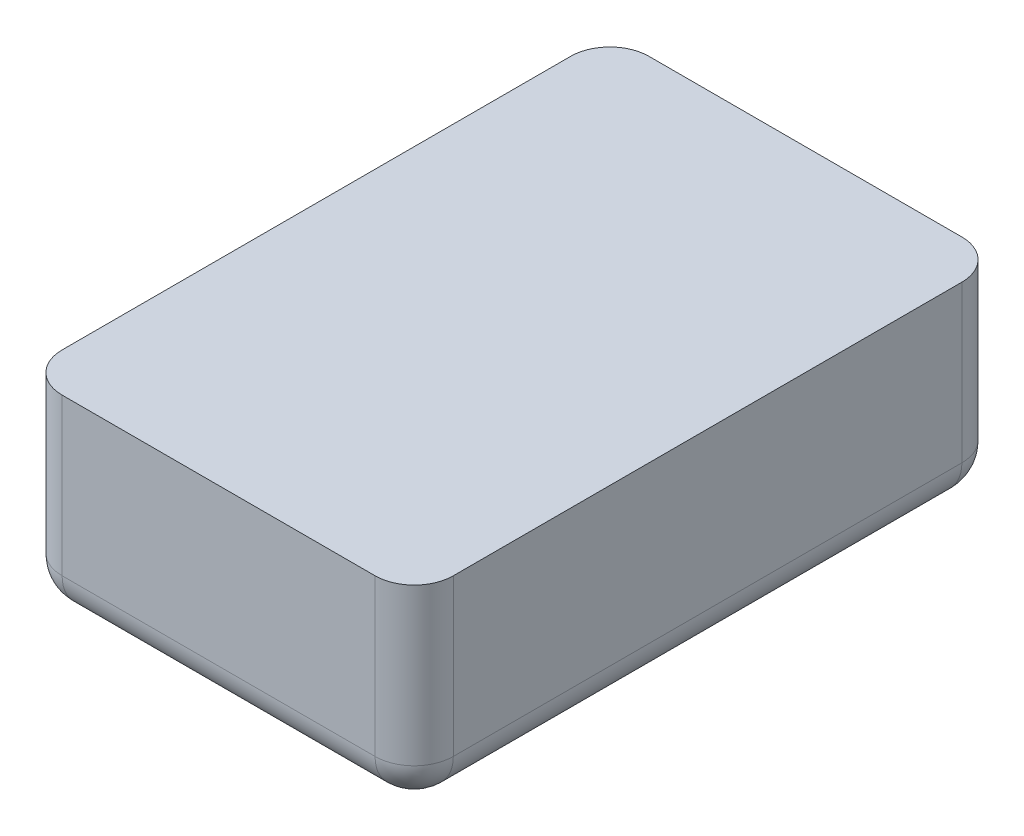
ISO-10303-21;
HEADER;
FILE_DESCRIPTION(('STEP AP214'),'2;1');
FILE_NAME('part.step','',(''),(''),'','','');
FILE_SCHEMA(('AUTOMOTIVE_DESIGN { 1 0 10303 214 1 1 1 1 }'));
ENDSEC;
DATA;
#1=APPLICATION_CONTEXT('core data for automotive mechanical design processes');
#2=APPLICATION_PROTOCOL_DEFINITION('international standard','automotive_design',2000,#1);
#3=PRODUCT_CONTEXT('',#1,'mechanical');
#4=PRODUCT('Part','Part','',(#3));
#5=PRODUCT_RELATED_PRODUCT_CATEGORY('part','',(#4));
#6=PRODUCT_DEFINITION_FORMATION('','',#4);
#7=PRODUCT_DEFINITION_CONTEXT('part definition',#1,'design');
#8=PRODUCT_DEFINITION('design','',#6,#7);
#9=PRODUCT_DEFINITION_SHAPE('','',#8);
#10=(LENGTH_UNIT() NAMED_UNIT(*) SI_UNIT(.MILLI.,.METRE.));
#11=(NAMED_UNIT(*) PLANE_ANGLE_UNIT() SI_UNIT($,.RADIAN.));
#12=(NAMED_UNIT(*) SI_UNIT($,.STERADIAN.) SOLID_ANGLE_UNIT());
#13=UNCERTAINTY_MEASURE_WITH_UNIT(LENGTH_MEASURE(1.E-05),#10,'distance_accuracy_value','');
#14=(GEOMETRIC_REPRESENTATION_CONTEXT(3) GLOBAL_UNCERTAINTY_ASSIGNED_CONTEXT((#13)) GLOBAL_UNIT_ASSIGNED_CONTEXT((#10,
#11,#12)) REPRESENTATION_CONTEXT('',''));
#15=CARTESIAN_POINT('',(0.,0.,0.));
#16=DIRECTION('',(0.,0.,1.));
#17=DIRECTION('',(1.,0.,0.));
#18=AXIS2_PLACEMENT_3D('',#15,#16,#17);
#19=CARTESIAN_POINT('',(0.,50.,0.));
#20=DIRECTION('',(1.,0.,0.));
#21=DIRECTION('',(0.,0.,-1.));
#22=AXIS2_PLACEMENT_3D('',#19,#20,#21);
#23=PLANE('',#22);
#24=DIRECTION('',(0.,0.,1.));
#25=VECTOR('',#24,1.);
#26=CARTESIAN_POINT('',(0.,10.,0.));
#27=LINE('',#26,#25);
#28=CARTESIAN_POINT('',(0.,10.,-140.));
#29=VERTEX_POINT('',#28);
#30=CARTESIAN_POINT('',(0.,10.,-10.));
#31=VERTEX_POINT('',#30);
#32=EDGE_CURVE('E49',#29,#31,#27,.T.);
#33=ORIENTED_EDGE('',*,*,#32,.T.);
#34=DIRECTION('',(0.,-1.,0.));
#35=VECTOR('',#34,1.);
#36=CARTESIAN_POINT('',(0.,50.,-10.));
#37=LINE('',#36,#35);
#38=CARTESIAN_POINT('',(0.,50.,-10.));
#39=VERTEX_POINT('',#38);
#40=EDGE_CURVE('E163',#31,#39,#37,.F.);
#41=ORIENTED_EDGE('',*,*,#40,.T.);
#42=DIRECTION('',(0.,0.,1.));
#43=VECTOR('',#42,1.);
#44=CARTESIAN_POINT('',(0.,50.,0.));
#45=LINE('',#44,#43);
#46=CARTESIAN_POINT('',(0.,50.,-140.));
#47=VERTEX_POINT('',#46);
#48=EDGE_CURVE('E198',#47,#39,#45,.T.);
#49=ORIENTED_EDGE('',*,*,#48,.F.);
#50=DIRECTION('',(0.,-1.,0.));
#51=VECTOR('',#50,1.);
#52=CARTESIAN_POINT('',(0.,50.,-140.));
#53=LINE('',#52,#51);
#54=EDGE_CURVE('E54',#47,#29,#53,.T.);
#55=ORIENTED_EDGE('',*,*,#54,.T.);
#56=EDGE_LOOP('',(#33,#41,#49,#55));
#57=FACE_BOUND('',#56,.T.);
#58=ADVANCED_FACE('F32',(#57),#23,.F.);
#59=CARTESIAN_POINT('',(0.,50.,0.));
#60=DIRECTION('',(0.,0.,-1.));
#61=DIRECTION('',(-1.,0.,0.));
#62=AXIS2_PLACEMENT_3D('',#59,#60,#61);
#63=PLANE('',#62);
#64=DIRECTION('',(1.,0.,0.));
#65=VECTOR('',#64,1.);
#66=CARTESIAN_POINT('',(0.,50.,0.));
#67=LINE('',#66,#65);
#68=CARTESIAN_POINT('',(10.,50.,0.));
#69=VERTEX_POINT('',#68);
#70=CARTESIAN_POINT('',(90.,50.,0.));
#71=VERTEX_POINT('',#70);
#72=EDGE_CURVE('E200',#69,#71,#67,.T.);
#73=ORIENTED_EDGE('',*,*,#72,.F.);
#74=DIRECTION('',(0.,-1.,0.));
#75=VECTOR('',#74,1.);
#76=CARTESIAN_POINT('',(10.,50.,0.));
#77=LINE('',#76,#75);
#78=CARTESIAN_POINT('',(10.,10.,0.));
#79=VERTEX_POINT('',#78);
#80=EDGE_CURVE('E159',#69,#79,#77,.T.);
#81=ORIENTED_EDGE('',*,*,#80,.T.);
#82=DIRECTION('',(1.,0.,0.));
#83=VECTOR('',#82,1.);
#84=CARTESIAN_POINT('',(100.,10.,0.));
#85=LINE('',#84,#83);
#86=CARTESIAN_POINT('',(90.,10.,0.));
#87=VERTEX_POINT('',#86);
#88=EDGE_CURVE('E157',#79,#87,#85,.T.);
#89=ORIENTED_EDGE('',*,*,#88,.T.);
#90=DIRECTION('',(0.,-1.,0.));
#91=VECTOR('',#90,1.);
#92=CARTESIAN_POINT('',(90.,50.,0.));
#93=LINE('',#92,#91);
#94=EDGE_CURVE('E155',#87,#71,#93,.F.);
#95=ORIENTED_EDGE('',*,*,#94,.T.);
#96=EDGE_LOOP('',(#73,#81,#89,#95));
#97=FACE_BOUND('',#96,.T.);
#98=ADVANCED_FACE('F249',(#97),#63,.F.);
#99=CARTESIAN_POINT('',(100.,50.,0.));
#100=DIRECTION('',(-1.,0.,0.));
#101=DIRECTION('',(0.,0.,1.));
#102=AXIS2_PLACEMENT_3D('',#99,#100,#101);
#103=PLANE('',#102);
#104=DIRECTION('',(0.,0.,-1.));
#105=VECTOR('',#104,1.);
#106=CARTESIAN_POINT('',(100.,50.,0.));
#107=LINE('',#106,#105);
#108=CARTESIAN_POINT('',(100.,50.,-10.));
#109=VERTEX_POINT('',#108);
#110=CARTESIAN_POINT('',(100.,50.,-140.));
#111=VERTEX_POINT('',#110);
#112=EDGE_CURVE('E117',#109,#111,#107,.T.);
#113=ORIENTED_EDGE('',*,*,#112,.F.);
#114=DIRECTION('',(0.,-1.,0.));
#115=VECTOR('',#114,1.);
#116=CARTESIAN_POINT('',(100.,50.,-10.));
#117=LINE('',#116,#115);
#118=CARTESIAN_POINT('',(100.,10.,-10.));
#119=VERTEX_POINT('',#118);
#120=EDGE_CURVE('E153',#109,#119,#117,.T.);
#121=ORIENTED_EDGE('',*,*,#120,.T.);
#122=DIRECTION('',(0.,0.,-1.));
#123=VECTOR('',#122,1.);
#124=CARTESIAN_POINT('',(100.,10.,-150.));
#125=LINE('',#124,#123);
#126=CARTESIAN_POINT('',(100.,10.,-140.));
#127=VERTEX_POINT('',#126);
#128=EDGE_CURVE('E151',#119,#127,#125,.T.);
#129=ORIENTED_EDGE('',*,*,#128,.T.);
#130=DIRECTION('',(0.,-1.,0.));
#131=VECTOR('',#130,1.);
#132=CARTESIAN_POINT('',(100.,50.,-140.));
#133=LINE('',#132,#131);
#134=EDGE_CURVE('E149',#127,#111,#133,.F.);
#135=ORIENTED_EDGE('',*,*,#134,.T.);
#136=EDGE_LOOP('',(#113,#121,#129,#135));
#137=FACE_BOUND('',#136,.T.);
#138=ADVANCED_FACE('F214',(#137),#103,.F.);
#139=CARTESIAN_POINT('',(0.,50.,-150.));
#140=DIRECTION('',(0.,0.,1.));
#141=DIRECTION('',(1.,0.,0.));
#142=AXIS2_PLACEMENT_3D('',#139,#140,#141);
#143=PLANE('',#142);
#144=DIRECTION('',(-1.,0.,0.));
#145=VECTOR('',#144,1.);
#146=CARTESIAN_POINT('',(0.,50.,-150.));
#147=LINE('',#146,#145);
#148=CARTESIAN_POINT('',(90.,50.,-150.));
#149=VERTEX_POINT('',#148);
#150=CARTESIAN_POINT('',(10.,50.,-150.));
#151=VERTEX_POINT('',#150);
#152=EDGE_CURVE('E114',#149,#151,#147,.T.);
#153=ORIENTED_EDGE('',*,*,#152,.F.);
#154=DIRECTION('',(0.,-1.,0.));
#155=VECTOR('',#154,1.);
#156=CARTESIAN_POINT('',(90.,50.,-150.));
#157=LINE('',#156,#155);
#158=CARTESIAN_POINT('',(90.,10.,-150.));
#159=VERTEX_POINT('',#158);
#160=EDGE_CURVE('E126',#149,#159,#157,.T.);
#161=ORIENTED_EDGE('',*,*,#160,.T.);
#162=DIRECTION('',(-1.,0.,0.));
#163=VECTOR('',#162,1.);
#164=CARTESIAN_POINT('',(0.,10.,-150.));
#165=LINE('',#164,#163);
#166=CARTESIAN_POINT('',(10.,10.,-150.));
#167=VERTEX_POINT('',#166);
#168=EDGE_CURVE('E136',#159,#167,#165,.T.);
#169=ORIENTED_EDGE('',*,*,#168,.T.);
#170=DIRECTION('',(0.,-1.,0.));
#171=VECTOR('',#170,1.);
#172=CARTESIAN_POINT('',(10.,50.,-150.));
#173=LINE('',#172,#171);
#174=EDGE_CURVE('E129',#167,#151,#173,.F.);
#175=ORIENTED_EDGE('',*,*,#174,.T.);
#176=EDGE_LOOP('',(#153,#161,#169,#175));
#177=FACE_BOUND('',#176,.T.);
#178=ADVANCED_FACE('F124',(#177),#143,.F.);
#179=CARTESIAN_POINT('',(0.,50.,0.));
#180=DIRECTION('',(0.,-1.,0.));
#181=DIRECTION('',(0.,0.,-1.));
#182=AXIS2_PLACEMENT_3D('',#179,#180,#181);
#183=PLANE('',#182);
#184=ORIENTED_EDGE('',*,*,#48,.T.);
#185=CARTESIAN_POINT('',(10.,50.,-10.));
#186=DIRECTION('',(0.,-1.,0.));
#187=DIRECTION('',(0.,0.,-1.));
#188=AXIS2_PLACEMENT_3D('',#185,#186,#187);
#189=CIRCLE('',#188,10.);
#190=EDGE_CURVE('E11',#39,#69,#189,.F.);
#191=ORIENTED_EDGE('',*,*,#190,.T.);
#192=ORIENTED_EDGE('',*,*,#72,.T.);
#193=CARTESIAN_POINT('',(90.,50.,-10.));
#194=DIRECTION('',(0.,-1.,0.));
#195=DIRECTION('',(0.,0.,-1.));
#196=AXIS2_PLACEMENT_3D('',#193,#194,#195);
#197=CIRCLE('',#196,10.);
#198=EDGE_CURVE('E41',#71,#109,#197,.F.);
#199=ORIENTED_EDGE('',*,*,#198,.T.);
#200=ORIENTED_EDGE('',*,*,#112,.T.);
#201=CARTESIAN_POINT('',(90.,50.,-140.));
#202=DIRECTION('',(0.,-1.,0.));
#203=DIRECTION('',(0.,0.,-1.));
#204=AXIS2_PLACEMENT_3D('',#201,#202,#203);
#205=CIRCLE('',#204,10.);
#206=EDGE_CURVE('E110',#111,#149,#205,.F.);
#207=ORIENTED_EDGE('',*,*,#206,.T.);
#208=ORIENTED_EDGE('',*,*,#152,.T.);
#209=CARTESIAN_POINT('',(10.,50.,-140.));
#210=DIRECTION('',(0.,-1.,0.));
#211=DIRECTION('',(0.,0.,-1.));
#212=AXIS2_PLACEMENT_3D('',#209,#210,#211);
#213=CIRCLE('',#212,10.);
#214=EDGE_CURVE('E121',#151,#47,#213,.F.);
#215=ORIENTED_EDGE('',*,*,#214,.T.);
#216=EDGE_LOOP('',(#184,#191,#192,#199,#200,#207,#208,#215));
#217=FACE_BOUND('',#216,.T.);
#218=ADVANCED_FACE('F113',(#217),#183,.F.);
#219=CARTESIAN_POINT('',(0.,0.,0.));
#220=DIRECTION('',(0.,-1.,0.));
#221=DIRECTION('',(0.,0.,-1.));
#222=AXIS2_PLACEMENT_3D('',#219,#220,#221);
#223=PLANE('',#222);
#224=DIRECTION('',(0.,0.,1.));
#225=VECTOR('',#224,1.);
#226=CARTESIAN_POINT('',(10.,0.,-150.));
#227=LINE('',#226,#225);
#228=CARTESIAN_POINT('',(10.,0.,-10.));
#229=VERTEX_POINT('',#228);
#230=CARTESIAN_POINT('',(10.,0.,-140.));
#231=VERTEX_POINT('',#230);
#232=EDGE_CURVE('E135',#229,#231,#227,.F.);
#233=ORIENTED_EDGE('',*,*,#232,.T.);
#234=DIRECTION('',(-1.,0.,0.));
#235=VECTOR('',#234,1.);
#236=CARTESIAN_POINT('',(100.,0.,-140.));
#237=LINE('',#236,#235);
#238=CARTESIAN_POINT('',(90.,0.,-140.));
#239=VERTEX_POINT('',#238);
#240=EDGE_CURVE('E146',#231,#239,#237,.F.);
#241=ORIENTED_EDGE('',*,*,#240,.T.);
#242=DIRECTION('',(0.,0.,-1.));
#243=VECTOR('',#242,1.);
#244=CARTESIAN_POINT('',(90.,0.,0.));
#245=LINE('',#244,#243);
#246=CARTESIAN_POINT('',(90.,0.,-10.));
#247=VERTEX_POINT('',#246);
#248=EDGE_CURVE('E144',#239,#247,#245,.F.);
#249=ORIENTED_EDGE('',*,*,#248,.T.);
#250=DIRECTION('',(1.,0.,0.));
#251=VECTOR('',#250,1.);
#252=CARTESIAN_POINT('',(0.,0.,-10.));
#253=LINE('',#252,#251);
#254=EDGE_CURVE('E138',#247,#229,#253,.F.);
#255=ORIENTED_EDGE('',*,*,#254,.T.);
#256=EDGE_LOOP('',(#233,#241,#249,#255));
#257=FACE_BOUND('',#256,.T.);
#258=ADVANCED_FACE('F244',(#257),#223,.T.);
#259=CARTESIAN_POINT('',(90.,50.,-10.));
#260=DIRECTION('',(0.,-1.,0.));
#261=DIRECTION('',(0.,0.,-1.));
#262=AXIS2_PLACEMENT_3D('',#259,#260,#261);
#263=CYLINDRICAL_SURFACE('',#262,10.);
#264=ORIENTED_EDGE('',*,*,#198,.F.);
#265=ORIENTED_EDGE('',*,*,#94,.F.);
#266=CARTESIAN_POINT('',(90.,10.,-10.));
#267=DIRECTION('',(0.,-1.,0.));
#268=DIRECTION('',(0.,0.,-1.));
#269=AXIS2_PLACEMENT_3D('',#266,#267,#268);
#270=CIRCLE('',#269,10.);
#271=EDGE_CURVE('E192',#119,#87,#270,.T.);
#272=ORIENTED_EDGE('',*,*,#271,.F.);
#273=ORIENTED_EDGE('',*,*,#120,.F.);
#274=EDGE_LOOP('',(#264,#265,#272,#273));
#275=FACE_BOUND('',#274,.T.);
#276=ADVANCED_FACE('F34',(#275),#263,.T.);
#277=CARTESIAN_POINT('',(10.,50.,-10.));
#278=DIRECTION('',(0.,-1.,0.));
#279=DIRECTION('',(0.,0.,-1.));
#280=AXIS2_PLACEMENT_3D('',#277,#278,#279);
#281=CYLINDRICAL_SURFACE('',#280,10.);
#282=ORIENTED_EDGE('',*,*,#190,.F.);
#283=ORIENTED_EDGE('',*,*,#40,.F.);
#284=CARTESIAN_POINT('',(10.,10.,-10.));
#285=DIRECTION('',(0.,-1.,0.));
#286=DIRECTION('',(0.,0.,-1.));
#287=AXIS2_PLACEMENT_3D('',#284,#285,#286);
#288=CIRCLE('',#287,10.);
#289=EDGE_CURVE('E190',#79,#31,#288,.T.);
#290=ORIENTED_EDGE('',*,*,#289,.F.);
#291=ORIENTED_EDGE('',*,*,#80,.F.);
#292=EDGE_LOOP('',(#282,#283,#290,#291));
#293=FACE_BOUND('',#292,.T.);
#294=ADVANCED_FACE('F235',(#293),#281,.T.);
#295=CARTESIAN_POINT('',(0.,10.,-10.));
#296=DIRECTION('',(-1.,0.,0.));
#297=DIRECTION('',(0.,0.,1.));
#298=AXIS2_PLACEMENT_3D('',#295,#296,#297);
#299=CYLINDRICAL_SURFACE('',#298,10.);
#300=CARTESIAN_POINT('',(90.,10.,-10.));
#301=DIRECTION('',(1.,0.,0.));
#302=DIRECTION('',(0.,0.,-1.));
#303=AXIS2_PLACEMENT_3D('',#300,#301,#302);
#304=CIRCLE('',#303,10.);
#305=EDGE_CURVE('E36',#87,#247,#304,.T.);
#306=ORIENTED_EDGE('',*,*,#305,.F.);
#307=ORIENTED_EDGE('',*,*,#88,.F.);
#308=CARTESIAN_POINT('',(10.,10.,-10.));
#309=DIRECTION('',(-1.,0.,0.));
#310=DIRECTION('',(0.,0.,1.));
#311=AXIS2_PLACEMENT_3D('',#308,#309,#310);
#312=CIRCLE('',#311,10.);
#313=EDGE_CURVE('E187',#229,#79,#312,.T.);
#314=ORIENTED_EDGE('',*,*,#313,.F.);
#315=ORIENTED_EDGE('',*,*,#254,.F.);
#316=EDGE_LOOP('',(#306,#307,#314,#315));
#317=FACE_BOUND('',#316,.T.);
#318=ADVANCED_FACE('F248',(#317),#299,.T.);
#319=CARTESIAN_POINT('',(90.,10.,-10.));
#320=DIRECTION('',(0.,0.,1.));
#321=DIRECTION('',(1.,0.,0.));
#322=AXIS2_PLACEMENT_3D('',#319,#320,#321);
#323=SPHERICAL_SURFACE('',#322,10.);
#324=ORIENTED_EDGE('',*,*,#271,.T.);
#325=ORIENTED_EDGE('',*,*,#305,.T.);
#326=CARTESIAN_POINT('',(90.,10.,-10.));
#327=DIRECTION('',(0.,0.,1.));
#328=DIRECTION('',(1.,0.,0.));
#329=AXIS2_PLACEMENT_3D('',#326,#327,#328);
#330=CIRCLE('',#329,10.);
#331=EDGE_CURVE('E184',#119,#247,#330,.F.);
#332=ORIENTED_EDGE('',*,*,#331,.F.);
#333=EDGE_LOOP('',(#324,#325,#332));
#334=FACE_BOUND('',#333,.T.);
#335=ADVANCED_FACE('F276',(#334),#323,.T.);
#336=CARTESIAN_POINT('',(10.,10.,-10.));
#337=DIRECTION('',(0.,0.,1.));
#338=DIRECTION('',(1.,0.,0.));
#339=AXIS2_PLACEMENT_3D('',#336,#337,#338);
#340=SPHERICAL_SURFACE('',#339,10.);
#341=ORIENTED_EDGE('',*,*,#313,.T.);
#342=ORIENTED_EDGE('',*,*,#289,.T.);
#343=CARTESIAN_POINT('',(10.,10.,-10.));
#344=DIRECTION('',(0.,0.,1.));
#345=DIRECTION('',(1.,0.,0.));
#346=AXIS2_PLACEMENT_3D('',#343,#344,#345);
#347=CIRCLE('',#346,10.);
#348=EDGE_CURVE('E181',#229,#31,#347,.F.);
#349=ORIENTED_EDGE('',*,*,#348,.F.);
#350=EDGE_LOOP('',(#341,#342,#349));
#351=FACE_BOUND('',#350,.T.);
#352=ADVANCED_FACE('F238',(#351),#340,.T.);
#353=CARTESIAN_POINT('',(90.,10.,0.));
#354=DIRECTION('',(0.,0.,1.));
#355=DIRECTION('',(1.,0.,0.));
#356=AXIS2_PLACEMENT_3D('',#353,#354,#355);
#357=CYLINDRICAL_SURFACE('',#356,10.);
#358=ORIENTED_EDGE('',*,*,#331,.T.);
#359=ORIENTED_EDGE('',*,*,#248,.F.);
#360=CARTESIAN_POINT('',(90.,10.,-140.));
#361=DIRECTION('',(0.,0.,-1.));
#362=DIRECTION('',(-1.,0.,0.));
#363=AXIS2_PLACEMENT_3D('',#360,#361,#362);
#364=CIRCLE('',#363,10.);
#365=EDGE_CURVE('E178',#127,#239,#364,.T.);
#366=ORIENTED_EDGE('',*,*,#365,.F.);
#367=ORIENTED_EDGE('',*,*,#128,.F.);
#368=EDGE_LOOP('',(#358,#359,#366,#367));
#369=FACE_BOUND('',#368,.T.);
#370=ADVANCED_FACE('F219',(#369),#357,.T.);
#371=CARTESIAN_POINT('',(90.,50.,-140.));
#372=DIRECTION('',(0.,-1.,0.));
#373=DIRECTION('',(0.,0.,-1.));
#374=AXIS2_PLACEMENT_3D('',#371,#372,#373);
#375=CYLINDRICAL_SURFACE('',#374,10.);
#376=ORIENTED_EDGE('',*,*,#206,.F.);
#377=ORIENTED_EDGE('',*,*,#134,.F.);
#378=CARTESIAN_POINT('',(90.,10.,-140.));
#379=DIRECTION('',(0.,-1.,0.));
#380=DIRECTION('',(0.,0.,-1.));
#381=AXIS2_PLACEMENT_3D('',#378,#379,#380);
#382=CIRCLE('',#381,10.);
#383=EDGE_CURVE('E133',#159,#127,#382,.T.);
#384=ORIENTED_EDGE('',*,*,#383,.F.);
#385=ORIENTED_EDGE('',*,*,#160,.F.);
#386=EDGE_LOOP('',(#376,#377,#384,#385));
#387=FACE_BOUND('',#386,.T.);
#388=ADVANCED_FACE('F131',(#387),#375,.T.);
#389=CARTESIAN_POINT('',(10.,50.,-140.));
#390=DIRECTION('',(0.,-1.,0.));
#391=DIRECTION('',(0.,0.,-1.));
#392=AXIS2_PLACEMENT_3D('',#389,#390,#391);
#393=CYLINDRICAL_SURFACE('',#392,10.);
#394=ORIENTED_EDGE('',*,*,#214,.F.);
#395=ORIENTED_EDGE('',*,*,#174,.F.);
#396=CARTESIAN_POINT('',(10.,10.,-140.));
#397=DIRECTION('',(0.,-1.,0.));
#398=DIRECTION('',(0.,0.,-1.));
#399=AXIS2_PLACEMENT_3D('',#396,#397,#398);
#400=CIRCLE('',#399,10.);
#401=EDGE_CURVE('E174',#29,#167,#400,.T.);
#402=ORIENTED_EDGE('',*,*,#401,.F.);
#403=ORIENTED_EDGE('',*,*,#54,.F.);
#404=EDGE_LOOP('',(#394,#395,#402,#403));
#405=FACE_BOUND('',#404,.T.);
#406=ADVANCED_FACE('F232',(#405),#393,.T.);
#407=CARTESIAN_POINT('',(10.,10.,0.));
#408=DIRECTION('',(0.,0.,-1.));
#409=DIRECTION('',(-1.,0.,0.));
#410=AXIS2_PLACEMENT_3D('',#407,#408,#409);
#411=CYLINDRICAL_SURFACE('',#410,10.);
#412=ORIENTED_EDGE('',*,*,#348,.T.);
#413=ORIENTED_EDGE('',*,*,#32,.F.);
#414=CARTESIAN_POINT('',(10.,10.,-140.));
#415=DIRECTION('',(0.,0.,-1.));
#416=DIRECTION('',(-1.,0.,0.));
#417=AXIS2_PLACEMENT_3D('',#414,#415,#416);
#418=CIRCLE('',#417,10.);
#419=EDGE_CURVE('E171',#231,#29,#418,.T.);
#420=ORIENTED_EDGE('',*,*,#419,.F.);
#421=ORIENTED_EDGE('',*,*,#232,.F.);
#422=EDGE_LOOP('',(#412,#413,#420,#421));
#423=FACE_BOUND('',#422,.T.);
#424=ADVANCED_FACE('F242',(#423),#411,.T.);
#425=CARTESIAN_POINT('',(90.,10.,-140.));
#426=DIRECTION('',(0.,0.,1.));
#427=DIRECTION('',(1.,0.,0.));
#428=AXIS2_PLACEMENT_3D('',#425,#426,#427);
#429=SPHERICAL_SURFACE('',#428,10.);
#430=ORIENTED_EDGE('',*,*,#383,.T.);
#431=ORIENTED_EDGE('',*,*,#365,.T.);
#432=CARTESIAN_POINT('',(90.,10.,-140.));
#433=DIRECTION('',(1.,0.,0.));
#434=DIRECTION('',(0.,0.,-1.));
#435=AXIS2_PLACEMENT_3D('',#432,#433,#434);
#436=CIRCLE('',#435,10.);
#437=EDGE_CURVE('E169',#159,#239,#436,.F.);
#438=ORIENTED_EDGE('',*,*,#437,.F.);
#439=EDGE_LOOP('',(#430,#431,#438));
#440=FACE_BOUND('',#439,.T.);
#441=ADVANCED_FACE('F221',(#440),#429,.T.);
#442=CARTESIAN_POINT('',(10.,10.,-140.));
#443=DIRECTION('',(0.,0.,1.));
#444=DIRECTION('',(1.,0.,0.));
#445=AXIS2_PLACEMENT_3D('',#442,#443,#444);
#446=SPHERICAL_SURFACE('',#445,10.);
#447=ORIENTED_EDGE('',*,*,#419,.T.);
#448=ORIENTED_EDGE('',*,*,#401,.T.);
#449=CARTESIAN_POINT('',(10.,10.,-140.));
#450=DIRECTION('',(-1.,0.,0.));
#451=DIRECTION('',(0.,0.,1.));
#452=AXIS2_PLACEMENT_3D('',#449,#450,#451);
#453=CIRCLE('',#452,10.);
#454=EDGE_CURVE('E167',#231,#167,#453,.F.);
#455=ORIENTED_EDGE('',*,*,#454,.F.);
#456=EDGE_LOOP('',(#447,#448,#455));
#457=FACE_BOUND('',#456,.T.);
#458=ADVANCED_FACE('F229',(#457),#446,.T.);
#459=CARTESIAN_POINT('',(0.,10.,-140.));
#460=DIRECTION('',(1.,0.,0.));
#461=DIRECTION('',(0.,0.,-1.));
#462=AXIS2_PLACEMENT_3D('',#459,#460,#461);
#463=CYLINDRICAL_SURFACE('',#462,10.);
#464=ORIENTED_EDGE('',*,*,#437,.T.);
#465=ORIENTED_EDGE('',*,*,#240,.F.);
#466=ORIENTED_EDGE('',*,*,#454,.T.);
#467=ORIENTED_EDGE('',*,*,#168,.F.);
#468=EDGE_LOOP('',(#464,#465,#466,#467));
#469=FACE_BOUND('',#468,.T.);
#470=ADVANCED_FACE('F225',(#469),#463,.T.);
#471=CLOSED_SHELL('',(#58,#98,#138,#178,#218,#258,#276,#294,#318,#335,#352,#370,#388,#406,#424,
#441,#458,#470));
#472=MANIFOLD_SOLID_BREP('B2',#471);
#473=ADVANCED_BREP_SHAPE_REPRESENTATION('',(#18,#472),#14);
#474=SHAPE_DEFINITION_REPRESENTATION(#9,#473);
ENDSEC;
END-ISO-10303-21;
